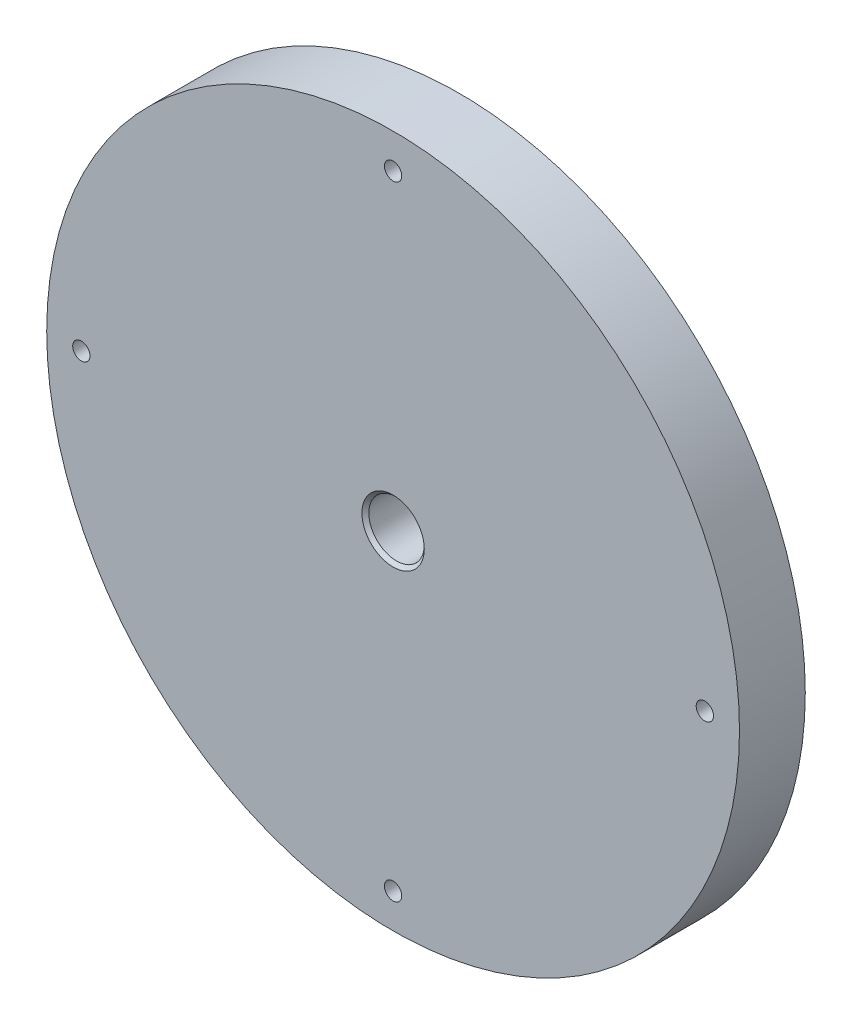
ISO-10303-21;
HEADER;
FILE_DESCRIPTION(('STEP AP214'),'2;1');
FILE_NAME('part.step','',(''),(''),'','','');
FILE_SCHEMA(('AUTOMOTIVE_DESIGN { 1 0 10303 214 1 1 1 1 }'));
ENDSEC;
DATA;
#1=APPLICATION_CONTEXT('core data for automotive mechanical design processes');
#2=APPLICATION_PROTOCOL_DEFINITION('international standard','automotive_design',2000,#1);
#3=PRODUCT_CONTEXT('',#1,'mechanical');
#4=PRODUCT('Part','Part','',(#3));
#5=PRODUCT_RELATED_PRODUCT_CATEGORY('part','',(#4));
#6=PRODUCT_DEFINITION_FORMATION('','',#4);
#7=PRODUCT_DEFINITION_CONTEXT('part definition',#1,'design');
#8=PRODUCT_DEFINITION('design','',#6,#7);
#9=PRODUCT_DEFINITION_SHAPE('','',#8);
#10=(LENGTH_UNIT() NAMED_UNIT(*) SI_UNIT(.MILLI.,.METRE.));
#11=(NAMED_UNIT(*) PLANE_ANGLE_UNIT() SI_UNIT($,.RADIAN.));
#12=(NAMED_UNIT(*) SI_UNIT($,.STERADIAN.) SOLID_ANGLE_UNIT());
#13=UNCERTAINTY_MEASURE_WITH_UNIT(LENGTH_MEASURE(1.E-05),#10,'distance_accuracy_value','');
#14=(GEOMETRIC_REPRESENTATION_CONTEXT(3) GLOBAL_UNCERTAINTY_ASSIGNED_CONTEXT((#13)) GLOBAL_UNIT_ASSIGNED_CONTEXT((#10,
#11,#12)) REPRESENTATION_CONTEXT('',''));
#15=CARTESIAN_POINT('',(0.,0.,0.));
#16=DIRECTION('',(0.,0.,1.));
#17=DIRECTION('',(1.,0.,0.));
#18=AXIS2_PLACEMENT_3D('',#15,#16,#17);
#19=CARTESIAN_POINT('',(0.,0.,19.));
#20=DIRECTION('',(0.,0.,-1.));
#21=DIRECTION('',(-1.,0.,0.));
#22=AXIS2_PLACEMENT_3D('',#19,#20,#21);
#23=CYLINDRICAL_SURFACE('',#22,100.);
#24=CARTESIAN_POINT('',(0.,0.,19.));
#25=DIRECTION('',(0.,0.,1.));
#26=DIRECTION('',(1.,0.,0.));
#27=AXIS2_PLACEMENT_3D('',#24,#25,#26);
#28=CIRCLE('',#27,100.);
#29=CARTESIAN_POINT('',(100.,0.,19.));
#30=VERTEX_POINT('',#29);
#31=EDGE_CURVE('E103',#30,#30,#28,.T.);
#32=ORIENTED_EDGE('',*,*,#31,.F.);
#33=EDGE_LOOP('',(#32));
#34=FACE_BOUND('',#33,.T.);
#35=CARTESIAN_POINT('',(0.,0.,0.));
#36=DIRECTION('',(0.,0.,1.));
#37=DIRECTION('',(1.,0.,0.));
#38=AXIS2_PLACEMENT_3D('',#35,#36,#37);
#39=CIRCLE('',#38,100.);
#40=CARTESIAN_POINT('',(100.,0.,0.));
#41=VERTEX_POINT('',#40);
#42=EDGE_CURVE('E102',#41,#41,#39,.T.);
#43=ORIENTED_EDGE('',*,*,#42,.T.);
#44=EDGE_LOOP('',(#43));
#45=FACE_BOUND('',#44,.T.);
#46=ADVANCED_FACE('F39',(#34,#45),#23,.T.);
#47=CARTESIAN_POINT('',(0.,0.,19.));
#48=DIRECTION('',(0.,0.,1.));
#49=DIRECTION('',(1.,0.,0.));
#50=AXIS2_PLACEMENT_3D('',#47,#48,#49);
#51=PLANE('',#50);
#52=CARTESIAN_POINT('',(0.,0.,19.));
#53=DIRECTION('',(0.,0.,1.));
#54=DIRECTION('',(1.,0.,0.));
#55=AXIS2_PLACEMENT_3D('',#52,#53,#54);
#56=CIRCLE('',#55,9.00000000000001);
#57=CARTESIAN_POINT('',(9.00000000000001,0.,19.));
#58=VERTEX_POINT('',#57);
#59=EDGE_CURVE('E114',#58,#58,#56,.F.);
#60=ORIENTED_EDGE('',*,*,#59,.T.);
#61=EDGE_LOOP('',(#60));
#62=FACE_BOUND('',#61,.T.);
#63=CARTESIAN_POINT('',(0.,90.,19.));
#64=DIRECTION('',(0.,0.,1.));
#65=DIRECTION('',(1.,0.,0.));
#66=AXIS2_PLACEMENT_3D('',#63,#64,#65);
#67=CIRCLE('',#66,2.49999999999999);
#68=CARTESIAN_POINT('',(2.49999999999999,90.,19.));
#69=VERTEX_POINT('',#68);
#70=EDGE_CURVE('E73',#69,#69,#67,.T.);
#71=ORIENTED_EDGE('',*,*,#70,.F.);
#72=EDGE_LOOP('',(#71));
#73=FACE_BOUND('',#72,.T.);
#74=CARTESIAN_POINT('',(-90.,0.,19.));
#75=DIRECTION('',(0.,0.,1.));
#76=DIRECTION('',(1.,0.,0.));
#77=AXIS2_PLACEMENT_3D('',#74,#75,#76);
#78=CIRCLE('',#77,2.49999999999999);
#79=CARTESIAN_POINT('',(-87.5,0.,19.));
#80=VERTEX_POINT('',#79);
#81=EDGE_CURVE('E72',#80,#80,#78,.T.);
#82=ORIENTED_EDGE('',*,*,#81,.F.);
#83=EDGE_LOOP('',(#82));
#84=FACE_BOUND('',#83,.T.);
#85=CARTESIAN_POINT('',(0.,-90.,19.));
#86=DIRECTION('',(0.,0.,1.));
#87=DIRECTION('',(1.,0.,0.));
#88=AXIS2_PLACEMENT_3D('',#85,#86,#87);
#89=CIRCLE('',#88,2.49999999999999);
#90=CARTESIAN_POINT('',(2.5,-90.,19.));
#91=VERTEX_POINT('',#90);
#92=EDGE_CURVE('E86',#91,#91,#89,.T.);
#93=ORIENTED_EDGE('',*,*,#92,.F.);
#94=EDGE_LOOP('',(#93));
#95=FACE_BOUND('',#94,.T.);
#96=CARTESIAN_POINT('',(90.,0.,19.));
#97=DIRECTION('',(0.,0.,1.));
#98=DIRECTION('',(1.,0.,0.));
#99=AXIS2_PLACEMENT_3D('',#96,#97,#98);
#100=CIRCLE('',#99,2.49999999999999);
#101=CARTESIAN_POINT('',(92.5,0.,19.));
#102=VERTEX_POINT('',#101);
#103=EDGE_CURVE('E94',#102,#102,#100,.T.);
#104=ORIENTED_EDGE('',*,*,#103,.F.);
#105=EDGE_LOOP('',(#104));
#106=FACE_BOUND('',#105,.T.);
#107=ORIENTED_EDGE('',*,*,#31,.T.);
#108=EDGE_LOOP('',(#107));
#109=FACE_BOUND('',#108,.T.);
#110=ADVANCED_FACE('F134',(#62,#73,#84,#95,#106,#109),#51,.T.);
#111=CARTESIAN_POINT('',(0.,0.,0.));
#112=DIRECTION('',(0.,0.,1.));
#113=DIRECTION('',(1.,0.,0.));
#114=AXIS2_PLACEMENT_3D('',#111,#112,#113);
#115=PLANE('',#114);
#116=CARTESIAN_POINT('',(0.,0.,0.));
#117=DIRECTION('',(0.,0.,1.));
#118=DIRECTION('',(1.,0.,0.));
#119=AXIS2_PLACEMENT_3D('',#116,#117,#118);
#120=CIRCLE('',#119,9.00000000000006);
#121=CARTESIAN_POINT('',(9.00000000000006,0.,0.));
#122=VERTEX_POINT('',#121);
#123=EDGE_CURVE('E48',#122,#122,#120,.T.);
#124=ORIENTED_EDGE('',*,*,#123,.T.);
#125=EDGE_LOOP('',(#124));
#126=FACE_BOUND('',#125,.T.);
#127=ORIENTED_EDGE('',*,*,#42,.F.);
#128=EDGE_LOOP('',(#127));
#129=FACE_BOUND('',#128,.T.);
#130=ADVANCED_FACE('F121',(#126,#129),#115,.F.);
#131=CARTESIAN_POINT('',(90.,0.,2.));
#132=DIRECTION('',(0.,0.,1.));
#133=DIRECTION('',(1.,0.,0.));
#134=AXIS2_PLACEMENT_3D('',#131,#132,#133);
#135=CONICAL_SURFACE('',#134,2.49999999999999,1.02974425867665);
#136=CARTESIAN_POINT('',(90.,0.,0.497848452431098));
#137=VERTEX_POINT('',#136);
#138=VERTEX_LOOP('',#137);
#139=FACE_BOUND('',#138,.T.);
#140=CARTESIAN_POINT('',(90.,0.,2.));
#141=DIRECTION('',(0.,0.,1.));
#142=DIRECTION('',(1.,0.,0.));
#143=AXIS2_PLACEMENT_3D('',#140,#141,#142);
#144=CIRCLE('',#143,2.49999999999999);
#145=CARTESIAN_POINT('',(92.5,0.,2.));
#146=VERTEX_POINT('',#145);
#147=EDGE_CURVE('E98',#146,#146,#144,.T.);
#148=ORIENTED_EDGE('',*,*,#147,.T.);
#149=EDGE_LOOP('',(#148));
#150=FACE_BOUND('',#149,.T.);
#151=ADVANCED_FACE('F146',(#139,#150),#135,.F.);
#152=CARTESIAN_POINT('',(90.,0.,19.));
#153=DIRECTION('',(0.,0.,1.));
#154=DIRECTION('',(1.,0.,0.));
#155=AXIS2_PLACEMENT_3D('',#152,#153,#154);
#156=CYLINDRICAL_SURFACE('',#155,2.49999999999999);
#157=ORIENTED_EDGE('',*,*,#147,.F.);
#158=EDGE_LOOP('',(#157));
#159=FACE_BOUND('',#158,.T.);
#160=ORIENTED_EDGE('',*,*,#103,.T.);
#161=EDGE_LOOP('',(#160));
#162=FACE_BOUND('',#161,.T.);
#163=ADVANCED_FACE('F150',(#159,#162),#156,.F.);
#164=CARTESIAN_POINT('',(0.,-90.,2.));
#165=DIRECTION('',(0.,0.,1.));
#166=DIRECTION('',(1.,0.,0.));
#167=AXIS2_PLACEMENT_3D('',#164,#165,#166);
#168=CONICAL_SURFACE('',#167,2.49999999999999,1.02974425867665);
#169=CARTESIAN_POINT('',(0.,-90.,0.497848452431098));
#170=VERTEX_POINT('',#169);
#171=VERTEX_LOOP('',#170);
#172=FACE_BOUND('',#171,.T.);
#173=CARTESIAN_POINT('',(0.,-90.,2.));
#174=DIRECTION('',(0.,0.,1.));
#175=DIRECTION('',(1.,0.,0.));
#176=AXIS2_PLACEMENT_3D('',#173,#174,#175);
#177=CIRCLE('',#176,2.49999999999999);
#178=CARTESIAN_POINT('',(2.5,-90.,2.));
#179=VERTEX_POINT('',#178);
#180=EDGE_CURVE('E90',#179,#179,#177,.T.);
#181=ORIENTED_EDGE('',*,*,#180,.T.);
#182=EDGE_LOOP('',(#181));
#183=FACE_BOUND('',#182,.T.);
#184=ADVANCED_FACE('F153',(#172,#183),#168,.F.);
#185=CARTESIAN_POINT('',(0.,-90.,19.));
#186=DIRECTION('',(0.,0.,1.));
#187=DIRECTION('',(1.,0.,0.));
#188=AXIS2_PLACEMENT_3D('',#185,#186,#187);
#189=CYLINDRICAL_SURFACE('',#188,2.49999999999999);
#190=ORIENTED_EDGE('',*,*,#180,.F.);
#191=EDGE_LOOP('',(#190));
#192=FACE_BOUND('',#191,.T.);
#193=ORIENTED_EDGE('',*,*,#92,.T.);
#194=EDGE_LOOP('',(#193));
#195=FACE_BOUND('',#194,.T.);
#196=ADVANCED_FACE('F157',(#192,#195),#189,.F.);
#197=CARTESIAN_POINT('',(-90.,0.,2.));
#198=DIRECTION('',(0.,0.,1.));
#199=DIRECTION('',(1.,0.,0.));
#200=AXIS2_PLACEMENT_3D('',#197,#198,#199);
#201=CONICAL_SURFACE('',#200,2.49999999999999,1.02974425867665);
#202=CARTESIAN_POINT('',(-90.,0.,0.497848452431098));
#203=VERTEX_POINT('',#202);
#204=VERTEX_LOOP('',#203);
#205=FACE_BOUND('',#204,.T.);
#206=CARTESIAN_POINT('',(-90.,0.,2.));
#207=DIRECTION('',(0.,0.,1.));
#208=DIRECTION('',(1.,0.,0.));
#209=AXIS2_PLACEMENT_3D('',#206,#207,#208);
#210=CIRCLE('',#209,2.49999999999999);
#211=CARTESIAN_POINT('',(-87.5,0.,2.));
#212=VERTEX_POINT('',#211);
#213=EDGE_CURVE('E78',#212,#212,#210,.T.);
#214=ORIENTED_EDGE('',*,*,#213,.T.);
#215=EDGE_LOOP('',(#214));
#216=FACE_BOUND('',#215,.T.);
#217=ADVANCED_FACE('F160',(#205,#216),#201,.F.);
#218=CARTESIAN_POINT('',(-90.,0.,19.));
#219=DIRECTION('',(0.,0.,1.));
#220=DIRECTION('',(1.,0.,0.));
#221=AXIS2_PLACEMENT_3D('',#218,#219,#220);
#222=CYLINDRICAL_SURFACE('',#221,2.49999999999999);
#223=ORIENTED_EDGE('',*,*,#213,.F.);
#224=EDGE_LOOP('',(#223));
#225=FACE_BOUND('',#224,.T.);
#226=ORIENTED_EDGE('',*,*,#81,.T.);
#227=EDGE_LOOP('',(#226));
#228=FACE_BOUND('',#227,.T.);
#229=ADVANCED_FACE('F65',(#225,#228),#222,.F.);
#230=CARTESIAN_POINT('',(0.,90.,2.));
#231=DIRECTION('',(0.,0.,1.));
#232=DIRECTION('',(1.,0.,0.));
#233=AXIS2_PLACEMENT_3D('',#230,#231,#232);
#234=CONICAL_SURFACE('',#233,2.49999999999999,1.02974425867665);
#235=CARTESIAN_POINT('',(0.,90.,0.497848452431098));
#236=VERTEX_POINT('',#235);
#237=VERTEX_LOOP('',#236);
#238=FACE_BOUND('',#237,.T.);
#239=CARTESIAN_POINT('',(0.,90.,2.));
#240=DIRECTION('',(0.,0.,1.));
#241=DIRECTION('',(1.,0.,0.));
#242=AXIS2_PLACEMENT_3D('',#239,#240,#241);
#243=CIRCLE('',#242,2.49999999999999);
#244=CARTESIAN_POINT('',(2.49999999999999,90.,2.));
#245=VERTEX_POINT('',#244);
#246=EDGE_CURVE('E69',#245,#245,#243,.T.);
#247=ORIENTED_EDGE('',*,*,#246,.T.);
#248=EDGE_LOOP('',(#247));
#249=FACE_BOUND('',#248,.T.);
#250=ADVANCED_FACE('F61',(#238,#249),#234,.F.);
#251=CARTESIAN_POINT('',(0.,90.,19.));
#252=DIRECTION('',(0.,0.,1.));
#253=DIRECTION('',(1.,0.,0.));
#254=AXIS2_PLACEMENT_3D('',#251,#252,#253);
#255=CYLINDRICAL_SURFACE('',#254,2.49999999999999);
#256=ORIENTED_EDGE('',*,*,#246,.F.);
#257=EDGE_LOOP('',(#256));
#258=FACE_BOUND('',#257,.T.);
#259=ORIENTED_EDGE('',*,*,#70,.T.);
#260=EDGE_LOOP('',(#259));
#261=FACE_BOUND('',#260,.T.);
#262=ADVANCED_FACE('F64',(#258,#261),#255,.F.);
#263=CARTESIAN_POINT('',(0.,0.,0.));
#264=DIRECTION('',(0.,0.,1.));
#265=DIRECTION('',(1.,0.,0.));
#266=AXIS2_PLACEMENT_3D('',#263,#264,#265);
#267=CYLINDRICAL_SURFACE('',#266,8.);
#268=CARTESIAN_POINT('',(0.,0.,1.00000000000006));
#269=DIRECTION('',(0.,0.,1.));
#270=DIRECTION('',(1.,0.,0.));
#271=AXIS2_PLACEMENT_3D('',#268,#269,#270);
#272=CIRCLE('',#271,8.);
#273=CARTESIAN_POINT('',(8.,0.,1.00000000000006));
#274=VERTEX_POINT('',#273);
#275=EDGE_CURVE('E11',#274,#274,#272,.F.);
#276=ORIENTED_EDGE('',*,*,#275,.T.);
#277=EDGE_LOOP('',(#276));
#278=FACE_BOUND('',#277,.T.);
#279=CARTESIAN_POINT('',(0.,0.,18.));
#280=DIRECTION('',(0.,0.,1.));
#281=DIRECTION('',(1.,0.,0.));
#282=AXIS2_PLACEMENT_3D('',#279,#280,#281);
#283=CIRCLE('',#282,8.);
#284=CARTESIAN_POINT('',(8.,0.,18.));
#285=VERTEX_POINT('',#284);
#286=EDGE_CURVE('E107',#285,#285,#283,.T.);
#287=ORIENTED_EDGE('',*,*,#286,.T.);
#288=EDGE_LOOP('',(#287));
#289=FACE_BOUND('',#288,.T.);
#290=ADVANCED_FACE('F130',(#278,#289),#267,.F.);
#291=CARTESIAN_POINT('',(0.,0.,18.));
#292=DIRECTION('',(0.,0.,1.));
#293=DIRECTION('',(1.,0.,0.));
#294=AXIS2_PLACEMENT_3D('',#291,#292,#293);
#295=CONICAL_SURFACE('',#294,8.,0.785398163397462);
#296=ORIENTED_EDGE('',*,*,#59,.F.);
#297=EDGE_LOOP('',(#296));
#298=FACE_BOUND('',#297,.T.);
#299=ORIENTED_EDGE('',*,*,#286,.F.);
#300=EDGE_LOOP('',(#299));
#301=FACE_BOUND('',#300,.T.);
#302=ADVANCED_FACE('F125',(#298,#301),#295,.F.);
#303=CARTESIAN_POINT('',(0.,0.,0.));
#304=DIRECTION('',(0.,0.,-1.));
#305=DIRECTION('',(-1.,0.,0.));
#306=AXIS2_PLACEMENT_3D('',#303,#304,#305);
#307=CONICAL_SURFACE('',#306,9.00000000000006,0.785398163397448);
#308=ORIENTED_EDGE('',*,*,#275,.F.);
#309=EDGE_LOOP('',(#308));
#310=FACE_BOUND('',#309,.T.);
#311=ORIENTED_EDGE('',*,*,#123,.F.);
#312=EDGE_LOOP('',(#311));
#313=FACE_BOUND('',#312,.T.);
#314=ADVANCED_FACE('F41',(#310,#313),#307,.F.);
#315=CLOSED_SHELL('',(#46,#110,#130,#151,#163,#184,#196,#217,#229,#250,#262,#290,#302,#314));
#316=MANIFOLD_SOLID_BREP('B2',#315);
#317=ADVANCED_BREP_SHAPE_REPRESENTATION('',(#18,#316),#14);
#318=SHAPE_DEFINITION_REPRESENTATION(#9,#317);
ENDSEC;
END-ISO-10303-21;
